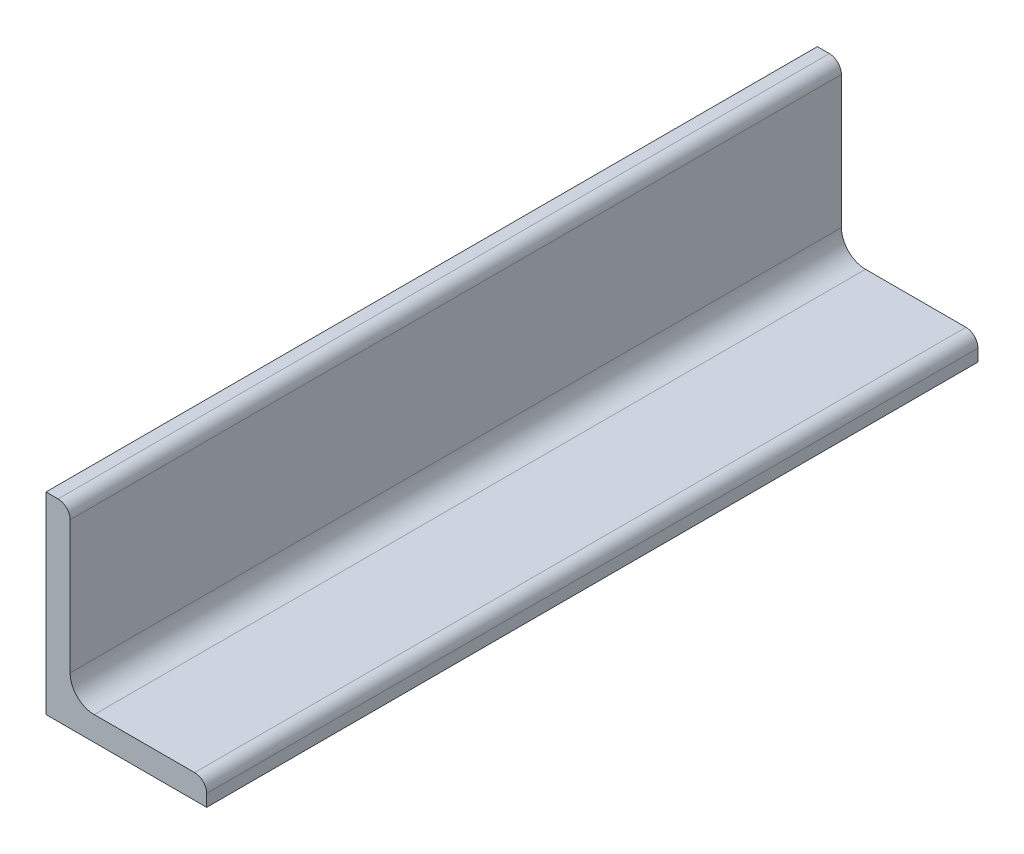
ISO-10303-21;
HEADER;
FILE_DESCRIPTION(('STEP AP214'),'2;1');
FILE_NAME('part.step','',(''),(''),'','','');
FILE_SCHEMA(('AUTOMOTIVE_DESIGN { 1 0 10303 214 1 1 1 1 }'));
ENDSEC;
DATA;
#1=APPLICATION_CONTEXT('core data for automotive mechanical design processes');
#2=APPLICATION_PROTOCOL_DEFINITION('international standard','automotive_design',2000,#1);
#3=PRODUCT_CONTEXT('',#1,'mechanical');
#4=PRODUCT('Part','Part','',(#3));
#5=PRODUCT_RELATED_PRODUCT_CATEGORY('part','',(#4));
#6=PRODUCT_DEFINITION_FORMATION('','',#4);
#7=PRODUCT_DEFINITION_CONTEXT('part definition',#1,'design');
#8=PRODUCT_DEFINITION('design','',#6,#7);
#9=PRODUCT_DEFINITION_SHAPE('','',#8);
#10=(LENGTH_UNIT() NAMED_UNIT(*) SI_UNIT(.MILLI.,.METRE.));
#11=(NAMED_UNIT(*) PLANE_ANGLE_UNIT() SI_UNIT($,.RADIAN.));
#12=(NAMED_UNIT(*) SI_UNIT($,.STERADIAN.) SOLID_ANGLE_UNIT());
#13=UNCERTAINTY_MEASURE_WITH_UNIT(LENGTH_MEASURE(1.E-05),#10,'distance_accuracy_value','');
#14=(GEOMETRIC_REPRESENTATION_CONTEXT(3) GLOBAL_UNCERTAINTY_ASSIGNED_CONTEXT((#13)) GLOBAL_UNIT_ASSIGNED_CONTEXT((#10,
#11,#12)) REPRESENTATION_CONTEXT('',''));
#15=CARTESIAN_POINT('',(0.,0.,0.));
#16=DIRECTION('',(0.,0.,1.));
#17=DIRECTION('',(1.,0.,0.));
#18=AXIS2_PLACEMENT_3D('',#15,#16,#17);
#19=CARTESIAN_POINT('',(0.897927251325018,76.2882459217981,304.8));
#20=DIRECTION('',(1.,0.,0.));
#21=DIRECTION('',(0.,0.,-1.));
#22=AXIS2_PLACEMENT_3D('',#19,#20,#21);
#23=PLANE('',#22);
#24=DIRECTION('',(0.,-1.,0.));
#25=VECTOR('',#24,1.);
#26=CARTESIAN_POINT('',(0.897927251325018,76.2882459217981,0.));
#27=LINE('',#26,#25);
#28=CARTESIAN_POINT('',(0.897927251325018,76.2882459217981,0.));
#29=VERTEX_POINT('',#28);
#30=CARTESIAN_POINT('',(0.897927251325018,0.0882459217980795,0.));
#31=VERTEX_POINT('',#30);
#32=EDGE_CURVE('E135',#29,#31,#27,.T.);
#33=ORIENTED_EDGE('',*,*,#32,.T.);
#34=DIRECTION('',(0.,0.,-1.));
#35=VECTOR('',#34,1.);
#36=CARTESIAN_POINT('',(0.897927251325018,0.0882459217980795,304.8));
#37=LINE('',#36,#35);
#38=CARTESIAN_POINT('',(0.897927251325018,0.0882459217980795,304.8));
#39=VERTEX_POINT('',#38);
#40=EDGE_CURVE('E11',#39,#31,#37,.T.);
#41=ORIENTED_EDGE('',*,*,#40,.F.);
#42=DIRECTION('',(0.,-1.,0.));
#43=VECTOR('',#42,1.);
#44=CARTESIAN_POINT('',(0.897927251325018,76.2882459217981,304.8));
#45=LINE('',#44,#43);
#46=CARTESIAN_POINT('',(0.897927251325018,76.2882459217981,304.8));
#47=VERTEX_POINT('',#46);
#48=EDGE_CURVE('E151',#47,#39,#45,.T.);
#49=ORIENTED_EDGE('',*,*,#48,.F.);
#50=DIRECTION('',(0.,0.,-1.));
#51=VECTOR('',#50,1.);
#52=CARTESIAN_POINT('',(0.897927251325018,76.2882459217981,304.8));
#53=LINE('',#52,#51);
#54=EDGE_CURVE('E131',#47,#29,#53,.T.);
#55=ORIENTED_EDGE('',*,*,#54,.T.);
#56=EDGE_LOOP('',(#33,#41,#49,#55));
#57=FACE_BOUND('',#56,.T.);
#58=ADVANCED_FACE('F33',(#57),#23,.F.);
#59=CARTESIAN_POINT('',(0.897927251325018,0.0882459217980795,304.8));
#60=DIRECTION('',(0.,1.,0.));
#61=DIRECTION('',(0.,0.,1.));
#62=AXIS2_PLACEMENT_3D('',#59,#60,#61);
#63=PLANE('',#62);
#64=DIRECTION('',(1.,0.,0.));
#65=VECTOR('',#64,1.);
#66=CARTESIAN_POINT('',(0.897927251325018,0.0882459217980795,0.));
#67=LINE('',#66,#65);
#68=CARTESIAN_POINT('',(64.397927251325,0.0882459217980795,0.));
#69=VERTEX_POINT('',#68);
#70=EDGE_CURVE('E138',#31,#69,#67,.T.);
#71=ORIENTED_EDGE('',*,*,#70,.T.);
#72=DIRECTION('',(0.,0.,-1.));
#73=VECTOR('',#72,1.);
#74=CARTESIAN_POINT('',(64.397927251325,0.0882459217980795,304.8));
#75=LINE('',#74,#73);
#76=CARTESIAN_POINT('',(64.397927251325,0.0882459217980795,304.8));
#77=VERTEX_POINT('',#76);
#78=EDGE_CURVE('E41',#77,#69,#75,.T.);
#79=ORIENTED_EDGE('',*,*,#78,.F.);
#80=DIRECTION('',(1.,0.,0.));
#81=VECTOR('',#80,1.);
#82=CARTESIAN_POINT('',(0.897927251325018,0.0882459217980795,304.8));
#83=LINE('',#82,#81);
#84=EDGE_CURVE('E95',#39,#77,#83,.T.);
#85=ORIENTED_EDGE('',*,*,#84,.F.);
#86=ORIENTED_EDGE('',*,*,#40,.T.);
#87=EDGE_LOOP('',(#71,#79,#85,#86));
#88=FACE_BOUND('',#87,.T.);
#89=ADVANCED_FACE('F194',(#88),#63,.F.);
#90=CARTESIAN_POINT('',(64.397927251325,0.0882459217980795,304.8));
#91=DIRECTION('',(-1.,0.,0.));
#92=DIRECTION('',(0.,0.,1.));
#93=AXIS2_PLACEMENT_3D('',#90,#91,#92);
#94=PLANE('',#93);
#95=DIRECTION('',(0.,1.,0.));
#96=VECTOR('',#95,1.);
#97=CARTESIAN_POINT('',(64.397927251325,0.0882459217980795,0.));
#98=LINE('',#97,#96);
#99=CARTESIAN_POINT('',(64.397927251325,4.85074592179808,0.));
#100=VERTEX_POINT('',#99);
#101=EDGE_CURVE('E140',#69,#100,#98,.T.);
#102=ORIENTED_EDGE('',*,*,#101,.T.);
#103=DIRECTION('',(0.,0.,-1.));
#104=VECTOR('',#103,1.);
#105=CARTESIAN_POINT('',(64.397927251325,4.85074592179808,304.8));
#106=LINE('',#105,#104);
#107=CARTESIAN_POINT('',(64.397927251325,4.85074592179808,304.8));
#108=VERTEX_POINT('',#107);
#109=EDGE_CURVE('E161',#108,#100,#106,.T.);
#110=ORIENTED_EDGE('',*,*,#109,.F.);
#111=DIRECTION('',(0.,1.,0.));
#112=VECTOR('',#111,1.);
#113=CARTESIAN_POINT('',(64.397927251325,0.0882459217980795,304.8));
#114=LINE('',#113,#112);
#115=EDGE_CURVE('E169',#77,#108,#114,.T.);
#116=ORIENTED_EDGE('',*,*,#115,.F.);
#117=ORIENTED_EDGE('',*,*,#78,.T.);
#118=EDGE_LOOP('',(#102,#110,#116,#117));
#119=FACE_BOUND('',#118,.T.);
#120=ADVANCED_FACE('F167',(#119),#94,.F.);
#121=CARTESIAN_POINT('',(59.635427251325,4.85074592179808,304.8));
#122=DIRECTION('',(0.,0.,-1.));
#123=DIRECTION('',(-1.,0.,0.));
#124=AXIS2_PLACEMENT_3D('',#121,#122,#123);
#125=CYLINDRICAL_SURFACE('',#124,4.7625);
#126=CARTESIAN_POINT('',(59.635427251325,4.85074592179808,0.));
#127=DIRECTION('',(0.,0.,1.));
#128=DIRECTION('',(1.,0.,0.));
#129=AXIS2_PLACEMENT_3D('',#126,#127,#128);
#130=CIRCLE('',#129,4.7625);
#131=CARTESIAN_POINT('',(59.635427251325,9.61324592179808,0.));
#132=VERTEX_POINT('',#131);
#133=EDGE_CURVE('E142',#100,#132,#130,.T.);
#134=ORIENTED_EDGE('',*,*,#133,.T.);
#135=DIRECTION('',(0.,0.,-1.));
#136=VECTOR('',#135,1.);
#137=CARTESIAN_POINT('',(59.635427251325,9.61324592179808,304.8));
#138=LINE('',#137,#136);
#139=CARTESIAN_POINT('',(59.635427251325,9.61324592179808,304.8));
#140=VERTEX_POINT('',#139);
#141=EDGE_CURVE('E158',#140,#132,#138,.T.);
#142=ORIENTED_EDGE('',*,*,#141,.F.);
#143=CARTESIAN_POINT('',(59.635427251325,4.85074592179808,304.8));
#144=DIRECTION('',(0.,0.,1.));
#145=DIRECTION('',(1.,0.,0.));
#146=AXIS2_PLACEMENT_3D('',#143,#144,#145);
#147=CIRCLE('',#146,4.7625);
#148=EDGE_CURVE('E185',#108,#140,#147,.T.);
#149=ORIENTED_EDGE('',*,*,#148,.F.);
#150=ORIENTED_EDGE('',*,*,#109,.T.);
#151=EDGE_LOOP('',(#134,#142,#149,#150));
#152=FACE_BOUND('',#151,.T.);
#153=ADVANCED_FACE('F178',(#152),#125,.T.);
#154=CARTESIAN_POINT('',(59.635427251325,9.61324592179808,304.8));
#155=DIRECTION('',(0.,-1.,0.));
#156=DIRECTION('',(0.,0.,-1.));
#157=AXIS2_PLACEMENT_3D('',#154,#155,#156);
#158=PLANE('',#157);
#159=DIRECTION('',(-1.,0.,0.));
#160=VECTOR('',#159,1.);
#161=CARTESIAN_POINT('',(59.635427251325,9.61324592179808,0.));
#162=LINE('',#161,#160);
#163=CARTESIAN_POINT('',(19.947927251325,9.61324592179808,0.));
#164=VERTEX_POINT('',#163);
#165=EDGE_CURVE('E144',#132,#164,#162,.T.);
#166=ORIENTED_EDGE('',*,*,#165,.T.);
#167=DIRECTION('',(0.,0.,-1.));
#168=VECTOR('',#167,1.);
#169=CARTESIAN_POINT('',(19.947927251325,9.61324592179808,304.8));
#170=LINE('',#169,#168);
#171=CARTESIAN_POINT('',(19.947927251325,9.61324592179808,304.8));
#172=VERTEX_POINT('',#171);
#173=EDGE_CURVE('E155',#172,#164,#170,.T.);
#174=ORIENTED_EDGE('',*,*,#173,.F.);
#175=DIRECTION('',(-1.,0.,0.));
#176=VECTOR('',#175,1.);
#177=CARTESIAN_POINT('',(59.635427251325,9.61324592179808,304.8));
#178=LINE('',#177,#176);
#179=EDGE_CURVE('E184',#140,#172,#178,.T.);
#180=ORIENTED_EDGE('',*,*,#179,.F.);
#181=ORIENTED_EDGE('',*,*,#141,.T.);
#182=EDGE_LOOP('',(#166,#174,#180,#181));
#183=FACE_BOUND('',#182,.T.);
#184=ADVANCED_FACE('F182',(#183),#158,.F.);
#185=CARTESIAN_POINT('',(19.947927251325,19.1382459217981,304.8));
#186=DIRECTION('',(0.,0.,-1.));
#187=DIRECTION('',(-1.,0.,0.));
#188=AXIS2_PLACEMENT_3D('',#185,#186,#187);
#189=CYLINDRICAL_SURFACE('',#188,9.52499999999999);
#190=CARTESIAN_POINT('',(19.947927251325,19.1382459217981,0.));
#191=DIRECTION('',(0.,0.,-1.));
#192=DIRECTION('',(1.,0.,0.));
#193=AXIS2_PLACEMENT_3D('',#190,#191,#192);
#194=CIRCLE('',#193,9.52499999999999);
#195=CARTESIAN_POINT('',(10.422927251325,19.1382459217981,0.));
#196=VERTEX_POINT('',#195);
#197=EDGE_CURVE('E146',#164,#196,#194,.T.);
#198=ORIENTED_EDGE('',*,*,#197,.T.);
#199=DIRECTION('',(0.,0.,-1.));
#200=VECTOR('',#199,1.);
#201=CARTESIAN_POINT('',(10.422927251325,19.1382459217981,304.8));
#202=LINE('',#201,#200);
#203=CARTESIAN_POINT('',(10.422927251325,19.1382459217981,304.8));
#204=VERTEX_POINT('',#203);
#205=EDGE_CURVE('E126',#204,#196,#202,.T.);
#206=ORIENTED_EDGE('',*,*,#205,.F.);
#207=CARTESIAN_POINT('',(19.947927251325,19.1382459217981,304.8));
#208=DIRECTION('',(0.,0.,-1.));
#209=DIRECTION('',(1.,0.,0.));
#210=AXIS2_PLACEMENT_3D('',#207,#208,#209);
#211=CIRCLE('',#210,9.52499999999999);
#212=EDGE_CURVE('E117',#172,#204,#211,.T.);
#213=ORIENTED_EDGE('',*,*,#212,.F.);
#214=ORIENTED_EDGE('',*,*,#173,.T.);
#215=EDGE_LOOP('',(#198,#206,#213,#214));
#216=FACE_BOUND('',#215,.T.);
#217=ADVANCED_FACE('F206',(#216),#189,.F.);
#218=CARTESIAN_POINT('',(10.422927251325,19.1382459217981,304.8));
#219=DIRECTION('',(-1.,0.,0.));
#220=DIRECTION('',(0.,0.,1.));
#221=AXIS2_PLACEMENT_3D('',#218,#219,#220);
#222=PLANE('',#221);
#223=DIRECTION('',(0.,1.,0.));
#224=VECTOR('',#223,1.);
#225=CARTESIAN_POINT('',(10.422927251325,19.1382459217981,0.));
#226=LINE('',#225,#224);
#227=CARTESIAN_POINT('',(10.422927251325,71.5257459217981,0.));
#228=VERTEX_POINT('',#227);
#229=EDGE_CURVE('E125',#196,#228,#226,.T.);
#230=ORIENTED_EDGE('',*,*,#229,.T.);
#231=DIRECTION('',(0.,0.,-1.));
#232=VECTOR('',#231,1.);
#233=CARTESIAN_POINT('',(10.422927251325,71.5257459217981,304.8));
#234=LINE('',#233,#232);
#235=CARTESIAN_POINT('',(10.422927251325,71.5257459217981,304.8));
#236=VERTEX_POINT('',#235);
#237=EDGE_CURVE('E122',#236,#228,#234,.T.);
#238=ORIENTED_EDGE('',*,*,#237,.F.);
#239=DIRECTION('',(0.,1.,0.));
#240=VECTOR('',#239,1.);
#241=CARTESIAN_POINT('',(10.422927251325,19.1382459217981,304.8));
#242=LINE('',#241,#240);
#243=EDGE_CURVE('E111',#204,#236,#242,.T.);
#244=ORIENTED_EDGE('',*,*,#243,.F.);
#245=ORIENTED_EDGE('',*,*,#205,.T.);
#246=EDGE_LOOP('',(#230,#238,#244,#245));
#247=FACE_BOUND('',#246,.T.);
#248=ADVANCED_FACE('F123',(#247),#222,.F.);
#249=CARTESIAN_POINT('',(5.66042725132501,71.5257459217981,304.8));
#250=DIRECTION('',(0.,0.,-1.));
#251=DIRECTION('',(-1.,0.,0.));
#252=AXIS2_PLACEMENT_3D('',#249,#250,#251);
#253=CYLINDRICAL_SURFACE('',#252,4.7625);
#254=CARTESIAN_POINT('',(5.66042725132501,71.5257459217981,0.));
#255=DIRECTION('',(0.,0.,1.));
#256=DIRECTION('',(1.,0.,0.));
#257=AXIS2_PLACEMENT_3D('',#254,#255,#256);
#258=CIRCLE('',#257,4.7625);
#259=CARTESIAN_POINT('',(5.66042725132502,76.2882459217981,0.));
#260=VERTEX_POINT('',#259);
#261=EDGE_CURVE('E81',#228,#260,#258,.T.);
#262=ORIENTED_EDGE('',*,*,#261,.T.);
#263=DIRECTION('',(0.,0.,-1.));
#264=VECTOR('',#263,1.);
#265=CARTESIAN_POINT('',(5.66042725132502,76.2882459217981,304.8));
#266=LINE('',#265,#264);
#267=CARTESIAN_POINT('',(5.66042725132502,76.2882459217981,304.8));
#268=VERTEX_POINT('',#267);
#269=EDGE_CURVE('E127',#268,#260,#266,.T.);
#270=ORIENTED_EDGE('',*,*,#269,.F.);
#271=CARTESIAN_POINT('',(5.66042725132501,71.5257459217981,304.8));
#272=DIRECTION('',(0.,0.,1.));
#273=DIRECTION('',(1.,0.,0.));
#274=AXIS2_PLACEMENT_3D('',#271,#272,#273);
#275=CIRCLE('',#274,4.7625);
#276=EDGE_CURVE('E115',#236,#268,#275,.T.);
#277=ORIENTED_EDGE('',*,*,#276,.F.);
#278=ORIENTED_EDGE('',*,*,#237,.T.);
#279=EDGE_LOOP('',(#262,#270,#277,#278));
#280=FACE_BOUND('',#279,.T.);
#281=ADVANCED_FACE('F129',(#280),#253,.T.);
#282=CARTESIAN_POINT('',(5.66042725132502,76.2882459217981,304.8));
#283=DIRECTION('',(0.,-1.,0.));
#284=DIRECTION('',(0.,0.,-1.));
#285=AXIS2_PLACEMENT_3D('',#282,#283,#284);
#286=PLANE('',#285);
#287=DIRECTION('',(-1.,0.,0.));
#288=VECTOR('',#287,1.);
#289=CARTESIAN_POINT('',(5.66042725132502,76.2882459217981,0.));
#290=LINE('',#289,#288);
#291=EDGE_CURVE('E87',#260,#29,#290,.T.);
#292=ORIENTED_EDGE('',*,*,#291,.T.);
#293=ORIENTED_EDGE('',*,*,#54,.F.);
#294=DIRECTION('',(-1.,0.,0.));
#295=VECTOR('',#294,1.);
#296=CARTESIAN_POINT('',(5.66042725132502,76.2882459217981,304.8));
#297=LINE('',#296,#295);
#298=EDGE_CURVE('E49',#268,#47,#297,.T.);
#299=ORIENTED_EDGE('',*,*,#298,.F.);
#300=ORIENTED_EDGE('',*,*,#269,.T.);
#301=EDGE_LOOP('',(#292,#293,#299,#300));
#302=FACE_BOUND('',#301,.T.);
#303=ADVANCED_FACE('F214',(#302),#286,.F.);
#304=CARTESIAN_POINT('',(59.635427251325,4.85074592179808,304.8));
#305=DIRECTION('',(0.,0.,1.));
#306=DIRECTION('',(1.,0.,0.));
#307=AXIS2_PLACEMENT_3D('',#304,#305,#306);
#308=PLANE('',#307);
#309=ORIENTED_EDGE('',*,*,#48,.T.);
#310=ORIENTED_EDGE('',*,*,#84,.T.);
#311=ORIENTED_EDGE('',*,*,#115,.T.);
#312=ORIENTED_EDGE('',*,*,#148,.T.);
#313=ORIENTED_EDGE('',*,*,#179,.T.);
#314=ORIENTED_EDGE('',*,*,#212,.T.);
#315=ORIENTED_EDGE('',*,*,#243,.T.);
#316=ORIENTED_EDGE('',*,*,#276,.T.);
#317=ORIENTED_EDGE('',*,*,#298,.T.);
#318=EDGE_LOOP('',(#309,#310,#311,#312,#313,#314,#315,#316,#317));
#319=FACE_BOUND('',#318,.T.);
#320=ADVANCED_FACE('F113',(#319),#308,.T.);
#321=CARTESIAN_POINT('',(59.635427251325,4.85074592179808,0.));
#322=DIRECTION('',(0.,0.,1.));
#323=DIRECTION('',(1.,0.,0.));
#324=AXIS2_PLACEMENT_3D('',#321,#322,#323);
#325=PLANE('',#324);
#326=ORIENTED_EDGE('',*,*,#32,.F.);
#327=ORIENTED_EDGE('',*,*,#291,.F.);
#328=ORIENTED_EDGE('',*,*,#261,.F.);
#329=ORIENTED_EDGE('',*,*,#229,.F.);
#330=ORIENTED_EDGE('',*,*,#197,.F.);
#331=ORIENTED_EDGE('',*,*,#165,.F.);
#332=ORIENTED_EDGE('',*,*,#133,.F.);
#333=ORIENTED_EDGE('',*,*,#101,.F.);
#334=ORIENTED_EDGE('',*,*,#70,.F.);
#335=EDGE_LOOP('',(#326,#327,#328,#329,#330,#331,#332,#333,#334));
#336=FACE_BOUND('',#335,.T.);
#337=ADVANCED_FACE('F173',(#336),#325,.F.);
#338=CLOSED_SHELL('',(#58,#89,#120,#153,#184,#217,#248,#281,#303,#320,#337));
#339=MANIFOLD_SOLID_BREP('B2',#338);
#340=ADVANCED_BREP_SHAPE_REPRESENTATION('',(#18,#339),#14);
#341=SHAPE_DEFINITION_REPRESENTATION(#9,#340);
ENDSEC;
END-ISO-10303-21;
